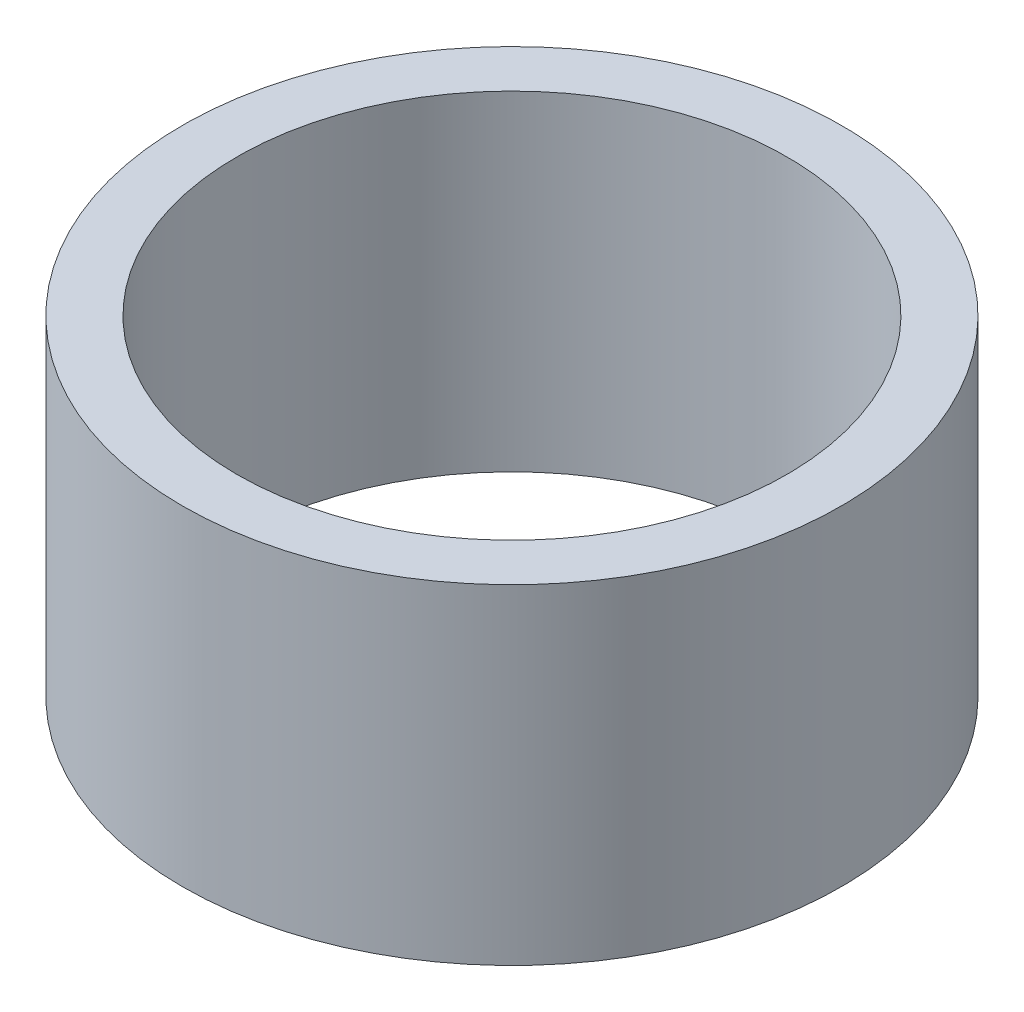
ISO-10303-21;
HEADER;
FILE_DESCRIPTION(('STEP AP214'),'2;1');
FILE_NAME('part.step','',(''),(''),'','','');
FILE_SCHEMA(('AUTOMOTIVE_DESIGN { 1 0 10303 214 1 1 1 1 }'));
ENDSEC;
DATA;
#1=APPLICATION_CONTEXT('core data for automotive mechanical design processes');
#2=APPLICATION_PROTOCOL_DEFINITION('international standard','automotive_design',2000,#1);
#3=PRODUCT_CONTEXT('',#1,'mechanical');
#4=PRODUCT('Part','Part','',(#3));
#5=PRODUCT_RELATED_PRODUCT_CATEGORY('part','',(#4));
#6=PRODUCT_DEFINITION_FORMATION('','',#4);
#7=PRODUCT_DEFINITION_CONTEXT('part definition',#1,'design');
#8=PRODUCT_DEFINITION('design','',#6,#7);
#9=PRODUCT_DEFINITION_SHAPE('','',#8);
#10=(LENGTH_UNIT() NAMED_UNIT(*) SI_UNIT(.MILLI.,.METRE.));
#11=(NAMED_UNIT(*) PLANE_ANGLE_UNIT() SI_UNIT($,.RADIAN.));
#12=(NAMED_UNIT(*) SI_UNIT($,.STERADIAN.) SOLID_ANGLE_UNIT());
#13=UNCERTAINTY_MEASURE_WITH_UNIT(LENGTH_MEASURE(1.E-05),#10,'distance_accuracy_value','');
#14=(GEOMETRIC_REPRESENTATION_CONTEXT(3) GLOBAL_UNCERTAINTY_ASSIGNED_CONTEXT((#13)) GLOBAL_UNIT_ASSIGNED_CONTEXT((#10,
#11,#12)) REPRESENTATION_CONTEXT('',''));
#15=CARTESIAN_POINT('',(0.,0.,0.));
#16=DIRECTION('',(0.,0.,1.));
#17=DIRECTION('',(1.,0.,0.));
#18=AXIS2_PLACEMENT_3D('',#15,#16,#17);
#19=CARTESIAN_POINT('',(0.,152.4,0.));
#20=DIRECTION('',(0.,-1.,0.));
#21=DIRECTION('',(0.,0.,-1.));
#22=AXIS2_PLACEMENT_3D('',#19,#20,#21);
#23=CYLINDRICAL_SURFACE('',#22,152.307886398273);
#24=CARTESIAN_POINT('',(0.,152.4,0.));
#25=DIRECTION('',(0.,1.,0.));
#26=DIRECTION('',(0.,0.,1.));
#27=AXIS2_PLACEMENT_3D('',#24,#25,#26);
#28=CIRCLE('',#27,152.307886398273);
#29=CARTESIAN_POINT('',(0.,152.4,152.307886398273));
#30=VERTEX_POINT('',#29);
#31=EDGE_CURVE('E10',#30,#30,#28,.T.);
#32=ORIENTED_EDGE('',*,*,#31,.F.);
#33=EDGE_LOOP('',(#32));
#34=FACE_BOUND('',#33,.T.);
#35=CARTESIAN_POINT('',(0.,0.,0.));
#36=DIRECTION('',(0.,1.,0.));
#37=DIRECTION('',(0.,0.,1.));
#38=AXIS2_PLACEMENT_3D('',#35,#36,#37);
#39=CIRCLE('',#38,152.307886398273);
#40=CARTESIAN_POINT('',(0.,0.,152.307886398273));
#41=VERTEX_POINT('',#40);
#42=EDGE_CURVE('E43',#41,#41,#39,.T.);
#43=ORIENTED_EDGE('',*,*,#42,.T.);
#44=EDGE_LOOP('',(#43));
#45=FACE_BOUND('',#44,.T.);
#46=ADVANCED_FACE('F40',(#34,#45),#23,.T.);
#47=CARTESIAN_POINT('',(0.,152.4,0.));
#48=DIRECTION('',(0.,1.,0.));
#49=DIRECTION('',(0.,0.,1.));
#50=AXIS2_PLACEMENT_3D('',#47,#48,#49);
#51=PLANE('',#50);
#52=CARTESIAN_POINT('',(0.,152.4,0.));
#53=DIRECTION('',(0.,1.,0.));
#54=DIRECTION('',(0.,0.,1.));
#55=AXIS2_PLACEMENT_3D('',#52,#53,#54);
#56=CIRCLE('',#55,127.120647113885);
#57=CARTESIAN_POINT('',(0.,152.4,127.120647113885));
#58=VERTEX_POINT('',#57);
#59=EDGE_CURVE('E52',#58,#58,#56,.T.);
#60=ORIENTED_EDGE('',*,*,#59,.F.);
#61=EDGE_LOOP('',(#60));
#62=FACE_BOUND('',#61,.T.);
#63=ORIENTED_EDGE('',*,*,#31,.T.);
#64=EDGE_LOOP('',(#63));
#65=FACE_BOUND('',#64,.T.);
#66=ADVANCED_FACE('F67',(#62,#65),#51,.T.);
#67=CARTESIAN_POINT('',(0.,0.,0.));
#68=DIRECTION('',(0.,1.,0.));
#69=DIRECTION('',(0.,0.,1.));
#70=AXIS2_PLACEMENT_3D('',#67,#68,#69);
#71=PLANE('',#70);
#72=CARTESIAN_POINT('',(0.,0.,0.));
#73=DIRECTION('',(0.,1.,0.));
#74=DIRECTION('',(0.,0.,1.));
#75=AXIS2_PLACEMENT_3D('',#72,#73,#74);
#76=CIRCLE('',#75,127.120647113885);
#77=CARTESIAN_POINT('',(0.,0.,127.120647113885));
#78=VERTEX_POINT('',#77);
#79=EDGE_CURVE('E50',#78,#78,#76,.T.);
#80=ORIENTED_EDGE('',*,*,#79,.T.);
#81=EDGE_LOOP('',(#80));
#82=FACE_BOUND('',#81,.T.);
#83=ORIENTED_EDGE('',*,*,#42,.F.);
#84=EDGE_LOOP('',(#83));
#85=FACE_BOUND('',#84,.T.);
#86=ADVANCED_FACE('F58',(#82,#85),#71,.F.);
#87=CARTESIAN_POINT('',(0.,0.,0.));
#88=DIRECTION('',(0.,1.,0.));
#89=DIRECTION('',(0.,0.,1.));
#90=AXIS2_PLACEMENT_3D('',#87,#88,#89);
#91=CYLINDRICAL_SURFACE('',#90,127.120647113885);
#92=ORIENTED_EDGE('',*,*,#79,.F.);
#93=EDGE_LOOP('',(#92));
#94=FACE_BOUND('',#93,.T.);
#95=ORIENTED_EDGE('',*,*,#59,.T.);
#96=EDGE_LOOP('',(#95));
#97=FACE_BOUND('',#96,.T.);
#98=ADVANCED_FACE('F61',(#94,#97),#91,.F.);
#99=CLOSED_SHELL('',(#46,#66,#86,#98));
#100=MANIFOLD_SOLID_BREP('B2',#99);
#101=ADVANCED_BREP_SHAPE_REPRESENTATION('',(#18,#100),#14);
#102=SHAPE_DEFINITION_REPRESENTATION(#9,#101);
ENDSEC;
END-ISO-10303-21;
